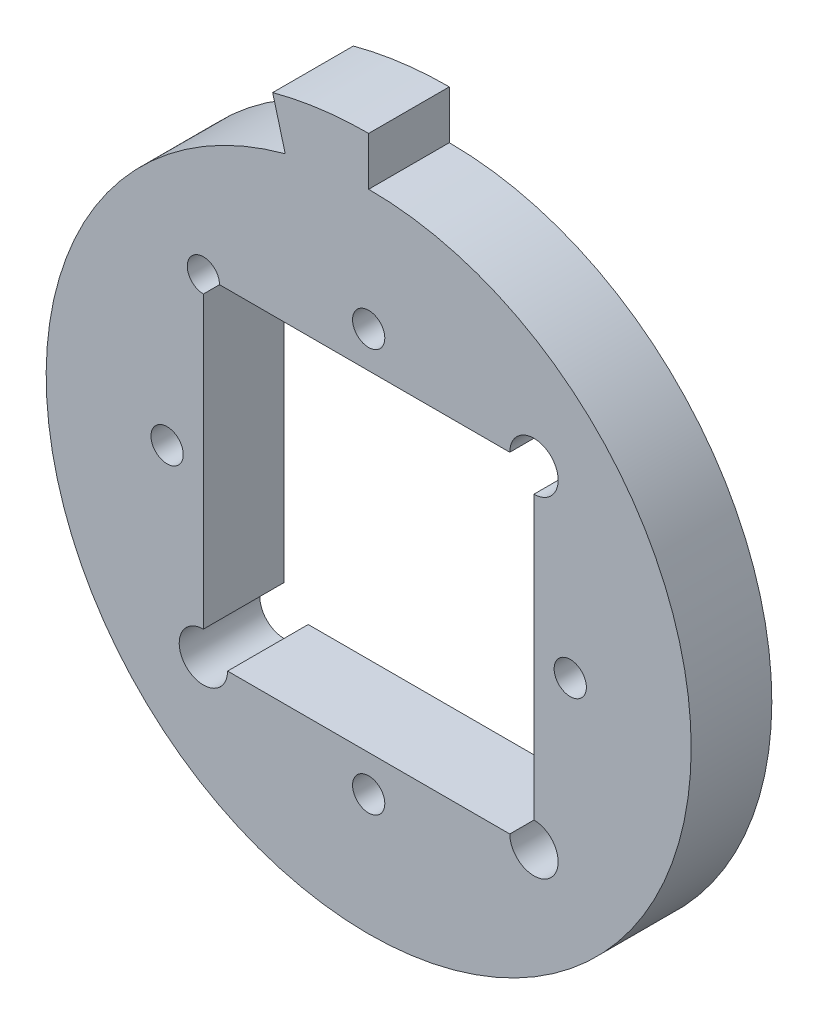
ISO-10303-21;
HEADER;
FILE_DESCRIPTION(('STEP AP214'),'2;1');
FILE_NAME('part.step','',(''),(''),'','','');
FILE_SCHEMA(('AUTOMOTIVE_DESIGN { 1 0 10303 214 1 1 1 1 }'));
ENDSEC;
DATA;
#1=APPLICATION_CONTEXT('core data for automotive mechanical design processes');
#2=APPLICATION_PROTOCOL_DEFINITION('international standard','automotive_design',2000,#1);
#3=PRODUCT_CONTEXT('',#1,'mechanical');
#4=PRODUCT('Part','Part','',(#3));
#5=PRODUCT_RELATED_PRODUCT_CATEGORY('part','',(#4));
#6=PRODUCT_DEFINITION_FORMATION('','',#4);
#7=PRODUCT_DEFINITION_CONTEXT('part definition',#1,'design');
#8=PRODUCT_DEFINITION('design','',#6,#7);
#9=PRODUCT_DEFINITION_SHAPE('','',#8);
#10=(LENGTH_UNIT() NAMED_UNIT(*) SI_UNIT(.MILLI.,.METRE.));
#11=(NAMED_UNIT(*) PLANE_ANGLE_UNIT() SI_UNIT($,.RADIAN.));
#12=(NAMED_UNIT(*) SI_UNIT($,.STERADIAN.) SOLID_ANGLE_UNIT());
#13=UNCERTAINTY_MEASURE_WITH_UNIT(LENGTH_MEASURE(1.E-05),#10,'distance_accuracy_value','');
#14=(GEOMETRIC_REPRESENTATION_CONTEXT(3) GLOBAL_UNCERTAINTY_ASSIGNED_CONTEXT((#13)) GLOBAL_UNIT_ASSIGNED_CONTEXT((#10,
#11,#12)) REPRESENTATION_CONTEXT('',''));
#15=CARTESIAN_POINT('',(0.,0.,0.));
#16=DIRECTION('',(0.,0.,1.));
#17=DIRECTION('',(1.,0.,0.));
#18=AXIS2_PLACEMENT_3D('',#15,#16,#17);
#19=CARTESIAN_POINT('',(0.,0.,5.));
#20=DIRECTION('',(0.,0.,-1.));
#21=DIRECTION('',(-1.,0.,0.));
#22=AXIS2_PLACEMENT_3D('',#19,#20,#21);
#23=CYLINDRICAL_SURFACE('',#22,20.);
#24=CARTESIAN_POINT('',(0.,0.,0.));
#25=DIRECTION('',(0.,0.,1.));
#26=DIRECTION('',(1.,0.,0.));
#27=AXIS2_PLACEMENT_3D('',#24,#25,#26);
#28=CIRCLE('',#27,20.);
#29=CARTESIAN_POINT('',(-5.17638090205043,19.3185165257814,0.));
#30=VERTEX_POINT('',#29);
#31=CARTESIAN_POINT('',(0.,20.,0.));
#32=VERTEX_POINT('',#31);
#33=EDGE_CURVE('E294',#30,#32,#28,.T.);
#34=ORIENTED_EDGE('',*,*,#33,.T.);
#35=DIRECTION('',(0.,0.,-1.));
#36=VECTOR('',#35,1.);
#37=CARTESIAN_POINT('',(0.,20.,5.));
#38=LINE('',#37,#36);
#39=CARTESIAN_POINT('',(0.,20.,5.));
#40=VERTEX_POINT('',#39);
#41=EDGE_CURVE('E12',#40,#32,#38,.T.);
#42=ORIENTED_EDGE('',*,*,#41,.F.);
#43=CARTESIAN_POINT('',(0.,0.,5.));
#44=DIRECTION('',(0.,0.,1.));
#45=DIRECTION('',(1.,0.,0.));
#46=AXIS2_PLACEMENT_3D('',#43,#44,#45);
#47=CIRCLE('',#46,20.);
#48=CARTESIAN_POINT('',(-5.17638090205043,19.3185165257814,5.));
#49=VERTEX_POINT('',#48);
#50=EDGE_CURVE('E163',#49,#40,#47,.T.);
#51=ORIENTED_EDGE('',*,*,#50,.F.);
#52=DIRECTION('',(0.,0.,-1.));
#53=VECTOR('',#52,1.);
#54=CARTESIAN_POINT('',(-5.17638090205043,19.3185165257814,5.));
#55=LINE('',#54,#53);
#56=EDGE_CURVE('E266',#49,#30,#55,.T.);
#57=ORIENTED_EDGE('',*,*,#56,.T.);
#58=EDGE_LOOP('',(#34,#42,#51,#57));
#59=FACE_BOUND('',#58,.T.);
#60=ADVANCED_FACE('F48',(#59),#23,.T.);
#61=CARTESIAN_POINT('',(0.,0.,5.));
#62=DIRECTION('',(1.,0.,0.));
#63=DIRECTION('',(0.,0.,-1.));
#64=AXIS2_PLACEMENT_3D('',#61,#62,#63);
#65=PLANE('',#64);
#66=DIRECTION('',(0.,-1.,0.));
#67=VECTOR('',#66,1.);
#68=CARTESIAN_POINT('',(0.,0.,0.));
#69=LINE('',#68,#67);
#70=CARTESIAN_POINT('',(0.,23.,0.));
#71=VERTEX_POINT('',#70);
#72=EDGE_CURVE('E153',#71,#32,#69,.T.);
#73=ORIENTED_EDGE('',*,*,#72,.F.);
#74=DIRECTION('',(0.,0.,-1.));
#75=VECTOR('',#74,1.);
#76=CARTESIAN_POINT('',(0.,23.,5.));
#77=LINE('',#76,#75);
#78=CARTESIAN_POINT('',(0.,23.,5.));
#79=VERTEX_POINT('',#78);
#80=EDGE_CURVE('E59',#79,#71,#77,.T.);
#81=ORIENTED_EDGE('',*,*,#80,.F.);
#82=DIRECTION('',(0.,-1.,0.));
#83=VECTOR('',#82,1.);
#84=CARTESIAN_POINT('',(0.,0.,5.));
#85=LINE('',#84,#83);
#86=EDGE_CURVE('E151',#79,#40,#85,.T.);
#87=ORIENTED_EDGE('',*,*,#86,.T.);
#88=ORIENTED_EDGE('',*,*,#41,.T.);
#89=EDGE_LOOP('',(#73,#81,#87,#88));
#90=FACE_BOUND('',#89,.T.);
#91=ADVANCED_FACE('F149',(#90),#65,.T.);
#92=CARTESIAN_POINT('',(0.,0.,5.));
#93=DIRECTION('',(0.,0.,-1.));
#94=DIRECTION('',(-1.,0.,0.));
#95=AXIS2_PLACEMENT_3D('',#92,#93,#94);
#96=CYLINDRICAL_SURFACE('',#95,23.);
#97=CARTESIAN_POINT('',(0.,0.,0.));
#98=DIRECTION('',(0.,0.,1.));
#99=DIRECTION('',(1.,0.,0.));
#100=AXIS2_PLACEMENT_3D('',#97,#98,#99);
#101=CIRCLE('',#100,23.);
#102=CARTESIAN_POINT('',(-5.952838037358,22.2162940046486,0.));
#103=VERTEX_POINT('',#102);
#104=EDGE_CURVE('E107',#71,#103,#101,.T.);
#105=ORIENTED_EDGE('',*,*,#104,.T.);
#106=DIRECTION('',(0.,0.,-1.));
#107=VECTOR('',#106,1.);
#108=CARTESIAN_POINT('',(-5.952838037358,22.2162940046486,5.));
#109=LINE('',#108,#107);
#110=CARTESIAN_POINT('',(-5.952838037358,22.2162940046486,5.));
#111=VERTEX_POINT('',#110);
#112=EDGE_CURVE('E155',#111,#103,#109,.T.);
#113=ORIENTED_EDGE('',*,*,#112,.F.);
#114=CARTESIAN_POINT('',(0.,0.,5.));
#115=DIRECTION('',(0.,0.,1.));
#116=DIRECTION('',(1.,0.,0.));
#117=AXIS2_PLACEMENT_3D('',#114,#115,#116);
#118=CIRCLE('',#117,23.);
#119=EDGE_CURVE('E157',#79,#111,#118,.T.);
#120=ORIENTED_EDGE('',*,*,#119,.F.);
#121=ORIENTED_EDGE('',*,*,#80,.T.);
#122=EDGE_LOOP('',(#105,#113,#120,#121));
#123=FACE_BOUND('',#122,.T.);
#124=ADVANCED_FACE('F158',(#123),#96,.T.);
#125=CARTESIAN_POINT('',(-10.25,-10.25,5.));
#126=DIRECTION('',(0.,0.,-1.));
#127=DIRECTION('',(-1.,0.,0.));
#128=AXIS2_PLACEMENT_3D('',#125,#126,#127);
#129=CYLINDRICAL_SURFACE('',#128,1.5);
#130=CARTESIAN_POINT('',(-10.25,-10.25,0.));
#131=DIRECTION('',(0.,0.,1.));
#132=DIRECTION('',(1.,0.,0.));
#133=AXIS2_PLACEMENT_3D('',#130,#131,#132);
#134=CIRCLE('',#133,1.5);
#135=CARTESIAN_POINT('',(-10.25,-8.75,0.));
#136=VERTEX_POINT('',#135);
#137=CARTESIAN_POINT('',(-8.75,-10.25,0.));
#138=VERTEX_POINT('',#137);
#139=EDGE_CURVE('E323',#136,#138,#134,.T.);
#140=ORIENTED_EDGE('',*,*,#139,.F.);
#141=DIRECTION('',(0.,0.,-1.));
#142=VECTOR('',#141,1.);
#143=CARTESIAN_POINT('',(-10.25,-8.75,5.));
#144=LINE('',#143,#142);
#145=CARTESIAN_POINT('',(-10.25,-8.75,5.));
#146=VERTEX_POINT('',#145);
#147=EDGE_CURVE('E52',#146,#136,#144,.T.);
#148=ORIENTED_EDGE('',*,*,#147,.F.);
#149=CARTESIAN_POINT('',(-10.25,-10.25,5.));
#150=DIRECTION('',(0.,0.,1.));
#151=DIRECTION('',(1.,0.,0.));
#152=AXIS2_PLACEMENT_3D('',#149,#150,#151);
#153=CIRCLE('',#152,1.5);
#154=CARTESIAN_POINT('',(-8.75,-10.25,5.));
#155=VERTEX_POINT('',#154);
#156=EDGE_CURVE('E213',#146,#155,#153,.T.);
#157=ORIENTED_EDGE('',*,*,#156,.T.);
#158=DIRECTION('',(0.,0.,-1.));
#159=VECTOR('',#158,1.);
#160=CARTESIAN_POINT('',(-8.75,-10.25,5.));
#161=LINE('',#160,#159);
#162=EDGE_CURVE('E281',#155,#138,#161,.T.);
#163=ORIENTED_EDGE('',*,*,#162,.T.);
#164=EDGE_LOOP('',(#140,#148,#157,#163));
#165=FACE_BOUND('',#164,.T.);
#166=ADVANCED_FACE('F50',(#165),#129,.F.);
#167=CARTESIAN_POINT('',(-10.25,0.,5.));
#168=DIRECTION('',(1.,0.,0.));
#169=DIRECTION('',(0.,1.,0.));
#170=AXIS2_PLACEMENT_3D('',#167,#168,#169);
#171=PLANE('',#170);
#172=DIRECTION('',(0.,-1.,0.));
#173=VECTOR('',#172,1.);
#174=CARTESIAN_POINT('',(-10.25,0.,0.));
#175=LINE('',#174,#173);
#176=CARTESIAN_POINT('',(-10.25,9.25,0.));
#177=VERTEX_POINT('',#176);
#178=EDGE_CURVE('E258',#177,#136,#175,.T.);
#179=ORIENTED_EDGE('',*,*,#178,.F.);
#180=DIRECTION('',(0.,0.,-1.));
#181=VECTOR('',#180,1.);
#182=CARTESIAN_POINT('',(-10.25,9.25,5.));
#183=LINE('',#182,#181);
#184=CARTESIAN_POINT('',(-10.25,9.25,5.));
#185=VERTEX_POINT('',#184);
#186=EDGE_CURVE('E256',#185,#177,#183,.T.);
#187=ORIENTED_EDGE('',*,*,#186,.F.);
#188=DIRECTION('',(0.,-1.,0.));
#189=VECTOR('',#188,1.);
#190=CARTESIAN_POINT('',(-10.25,0.,5.));
#191=LINE('',#190,#189);
#192=EDGE_CURVE('E208',#185,#146,#191,.T.);
#193=ORIENTED_EDGE('',*,*,#192,.T.);
#194=ORIENTED_EDGE('',*,*,#147,.T.);
#195=EDGE_LOOP('',(#179,#187,#193,#194));
#196=FACE_BOUND('',#195,.T.);
#197=ADVANCED_FACE('F255',(#196),#171,.T.);
#198=CARTESIAN_POINT('',(-10.25,10.25,5.));
#199=DIRECTION('',(0.,0.,-1.));
#200=DIRECTION('',(-1.,0.,0.));
#201=AXIS2_PLACEMENT_3D('',#198,#199,#200);
#202=CYLINDRICAL_SURFACE('',#201,1.);
#203=CARTESIAN_POINT('',(-10.25,10.25,0.));
#204=DIRECTION('',(0.,0.,1.));
#205=DIRECTION('',(1.,0.,0.));
#206=AXIS2_PLACEMENT_3D('',#203,#204,#205);
#207=CIRCLE('',#206,1.);
#208=CARTESIAN_POINT('',(-9.25000000000001,10.25,0.));
#209=VERTEX_POINT('',#208);
#210=EDGE_CURVE('E318',#209,#177,#207,.T.);
#211=ORIENTED_EDGE('',*,*,#210,.F.);
#212=DIRECTION('',(0.,0.,-1.));
#213=VECTOR('',#212,1.);
#214=CARTESIAN_POINT('',(-9.25000000000001,10.25,5.));
#215=LINE('',#214,#213);
#216=CARTESIAN_POINT('',(-9.25000000000001,10.25,5.));
#217=VERTEX_POINT('',#216);
#218=EDGE_CURVE('E263',#217,#209,#215,.T.);
#219=ORIENTED_EDGE('',*,*,#218,.F.);
#220=CARTESIAN_POINT('',(-10.25,10.25,5.));
#221=DIRECTION('',(0.,0.,1.));
#222=DIRECTION('',(1.,0.,0.));
#223=AXIS2_PLACEMENT_3D('',#220,#221,#222);
#224=CIRCLE('',#223,1.);
#225=EDGE_CURVE('E203',#217,#185,#224,.T.);
#226=ORIENTED_EDGE('',*,*,#225,.T.);
#227=ORIENTED_EDGE('',*,*,#186,.T.);
#228=EDGE_LOOP('',(#211,#219,#226,#227));
#229=FACE_BOUND('',#228,.T.);
#230=ADVANCED_FACE('F398',(#229),#202,.F.);
#231=CARTESIAN_POINT('',(0.,10.25,5.));
#232=DIRECTION('',(0.,1.,0.));
#233=DIRECTION('',(-1.,0.,0.));
#234=AXIS2_PLACEMENT_3D('',#231,#232,#233);
#235=PLANE('',#234);
#236=DIRECTION('',(1.,0.,0.));
#237=VECTOR('',#236,1.);
#238=CARTESIAN_POINT('',(0.,10.25,0.));
#239=LINE('',#238,#237);
#240=CARTESIAN_POINT('',(8.74999999999999,10.25,0.));
#241=VERTEX_POINT('',#240);
#242=EDGE_CURVE('E314',#209,#241,#239,.T.);
#243=ORIENTED_EDGE('',*,*,#242,.T.);
#244=DIRECTION('',(0.,0.,-1.));
#245=VECTOR('',#244,1.);
#246=CARTESIAN_POINT('',(8.74999999999999,10.25,5.));
#247=LINE('',#246,#245);
#248=CARTESIAN_POINT('',(8.74999999999999,10.25,5.));
#249=VERTEX_POINT('',#248);
#250=EDGE_CURVE('E267',#249,#241,#247,.T.);
#251=ORIENTED_EDGE('',*,*,#250,.F.);
#252=DIRECTION('',(1.,0.,0.));
#253=VECTOR('',#252,1.);
#254=CARTESIAN_POINT('',(0.,10.25,5.));
#255=LINE('',#254,#253);
#256=EDGE_CURVE('E200',#217,#249,#255,.T.);
#257=ORIENTED_EDGE('',*,*,#256,.F.);
#258=ORIENTED_EDGE('',*,*,#218,.T.);
#259=EDGE_LOOP('',(#243,#251,#257,#258));
#260=FACE_BOUND('',#259,.T.);
#261=ADVANCED_FACE('F394',(#260),#235,.F.);
#262=CARTESIAN_POINT('',(10.25,10.25,5.));
#263=DIRECTION('',(0.,0.,-1.));
#264=DIRECTION('',(-1.,0.,0.));
#265=AXIS2_PLACEMENT_3D('',#262,#263,#264);
#266=CYLINDRICAL_SURFACE('',#265,1.5);
#267=CARTESIAN_POINT('',(10.25,10.25,0.));
#268=DIRECTION('',(0.,0.,1.));
#269=DIRECTION('',(1.,0.,0.));
#270=AXIS2_PLACEMENT_3D('',#267,#268,#269);
#271=CIRCLE('',#270,1.5);
#272=CARTESIAN_POINT('',(10.25,8.75,0.));
#273=VERTEX_POINT('',#272);
#274=EDGE_CURVE('E310',#273,#241,#271,.T.);
#275=ORIENTED_EDGE('',*,*,#274,.F.);
#276=DIRECTION('',(0.,0.,-1.));
#277=VECTOR('',#276,1.);
#278=CARTESIAN_POINT('',(10.25,8.75,5.));
#279=LINE('',#278,#277);
#280=CARTESIAN_POINT('',(10.25,8.75,5.));
#281=VERTEX_POINT('',#280);
#282=EDGE_CURVE('E272',#281,#273,#279,.T.);
#283=ORIENTED_EDGE('',*,*,#282,.F.);
#284=CARTESIAN_POINT('',(10.25,10.25,5.));
#285=DIRECTION('',(0.,0.,1.));
#286=DIRECTION('',(1.,0.,0.));
#287=AXIS2_PLACEMENT_3D('',#284,#285,#286);
#288=CIRCLE('',#287,1.5);
#289=EDGE_CURVE('E192',#281,#249,#288,.T.);
#290=ORIENTED_EDGE('',*,*,#289,.T.);
#291=ORIENTED_EDGE('',*,*,#250,.T.);
#292=EDGE_LOOP('',(#275,#283,#290,#291));
#293=FACE_BOUND('',#292,.T.);
#294=ADVANCED_FACE('F390',(#293),#266,.F.);
#295=CARTESIAN_POINT('',(10.25,0.,5.));
#296=DIRECTION('',(1.,0.,0.));
#297=DIRECTION('',(0.,1.,0.));
#298=AXIS2_PLACEMENT_3D('',#295,#296,#297);
#299=PLANE('',#298);
#300=DIRECTION('',(0.,-1.,0.));
#301=VECTOR('',#300,1.);
#302=CARTESIAN_POINT('',(10.25,0.,0.));
#303=LINE('',#302,#301);
#304=CARTESIAN_POINT('',(10.25,-8.75,0.));
#305=VERTEX_POINT('',#304);
#306=EDGE_CURVE('E306',#273,#305,#303,.T.);
#307=ORIENTED_EDGE('',*,*,#306,.T.);
#308=DIRECTION('',(0.,0.,-1.));
#309=VECTOR('',#308,1.);
#310=CARTESIAN_POINT('',(10.25,-8.75,5.));
#311=LINE('',#310,#309);
#312=CARTESIAN_POINT('',(10.25,-8.75,5.));
#313=VERTEX_POINT('',#312);
#314=EDGE_CURVE('E275',#313,#305,#311,.T.);
#315=ORIENTED_EDGE('',*,*,#314,.F.);
#316=DIRECTION('',(0.,-1.,0.));
#317=VECTOR('',#316,1.);
#318=CARTESIAN_POINT('',(10.25,0.,5.));
#319=LINE('',#318,#317);
#320=EDGE_CURVE('E188',#281,#313,#319,.T.);
#321=ORIENTED_EDGE('',*,*,#320,.F.);
#322=ORIENTED_EDGE('',*,*,#282,.T.);
#323=EDGE_LOOP('',(#307,#315,#321,#322));
#324=FACE_BOUND('',#323,.T.);
#325=ADVANCED_FACE('F386',(#324),#299,.F.);
#326=CARTESIAN_POINT('',(10.25,-10.25,5.));
#327=DIRECTION('',(0.,0.,-1.));
#328=DIRECTION('',(-1.,0.,0.));
#329=AXIS2_PLACEMENT_3D('',#326,#327,#328);
#330=CYLINDRICAL_SURFACE('',#329,1.5);
#331=CARTESIAN_POINT('',(10.25,-10.25,0.));
#332=DIRECTION('',(0.,0.,1.));
#333=DIRECTION('',(1.,0.,0.));
#334=AXIS2_PLACEMENT_3D('',#331,#332,#333);
#335=CIRCLE('',#334,1.5);
#336=CARTESIAN_POINT('',(8.75,-10.25,0.));
#337=VERTEX_POINT('',#336);
#338=EDGE_CURVE('E302',#337,#305,#335,.T.);
#339=ORIENTED_EDGE('',*,*,#338,.F.);
#340=DIRECTION('',(0.,0.,-1.));
#341=VECTOR('',#340,1.);
#342=CARTESIAN_POINT('',(8.75,-10.25,5.));
#343=LINE('',#342,#341);
#344=CARTESIAN_POINT('',(8.75,-10.25,5.));
#345=VERTEX_POINT('',#344);
#346=EDGE_CURVE('E278',#345,#337,#343,.T.);
#347=ORIENTED_EDGE('',*,*,#346,.F.);
#348=CARTESIAN_POINT('',(10.25,-10.25,5.));
#349=DIRECTION('',(0.,0.,1.));
#350=DIRECTION('',(1.,0.,0.));
#351=AXIS2_PLACEMENT_3D('',#348,#349,#350);
#352=CIRCLE('',#351,1.5);
#353=EDGE_CURVE('E183',#345,#313,#352,.T.);
#354=ORIENTED_EDGE('',*,*,#353,.T.);
#355=ORIENTED_EDGE('',*,*,#314,.T.);
#356=EDGE_LOOP('',(#339,#347,#354,#355));
#357=FACE_BOUND('',#356,.T.);
#358=ADVANCED_FACE('F382',(#357),#330,.F.);
#359=CARTESIAN_POINT('',(0.,-10.25,5.));
#360=DIRECTION('',(0.,1.,0.));
#361=DIRECTION('',(0.,0.,1.));
#362=AXIS2_PLACEMENT_3D('',#359,#360,#361);
#363=PLANE('',#362);
#364=DIRECTION('',(1.,0.,0.));
#365=VECTOR('',#364,1.);
#366=CARTESIAN_POINT('',(0.,-10.25,0.));
#367=LINE('',#366,#365);
#368=EDGE_CURVE('E298',#138,#337,#367,.T.);
#369=ORIENTED_EDGE('',*,*,#368,.F.);
#370=ORIENTED_EDGE('',*,*,#162,.F.);
#371=DIRECTION('',(1.,0.,0.));
#372=VECTOR('',#371,1.);
#373=CARTESIAN_POINT('',(0.,-10.25,5.));
#374=LINE('',#373,#372);
#375=EDGE_CURVE('E168',#155,#345,#374,.T.);
#376=ORIENTED_EDGE('',*,*,#375,.T.);
#377=ORIENTED_EDGE('',*,*,#346,.T.);
#378=EDGE_LOOP('',(#369,#370,#376,#377));
#379=FACE_BOUND('',#378,.T.);
#380=ADVANCED_FACE('F379',(#379),#363,.T.);
#381=CARTESIAN_POINT('',(0.,0.,5.));
#382=DIRECTION('',(0.965925826289068,0.258819045102521,0.));
#383=DIRECTION('',(-0.258819045102521,0.965925826289068,0.));
#384=AXIS2_PLACEMENT_3D('',#381,#382,#383);
#385=PLANE('',#384);
#386=DIRECTION('',(0.258819045102521,-0.965925826289068,0.));
#387=VECTOR('',#386,1.);
#388=CARTESIAN_POINT('',(0.,0.,0.));
#389=LINE('',#388,#387);
#390=EDGE_CURVE('E113',#103,#30,#389,.T.);
#391=ORIENTED_EDGE('',*,*,#390,.T.);
#392=ORIENTED_EDGE('',*,*,#56,.F.);
#393=DIRECTION('',(0.258819045102521,-0.965925826289068,0.));
#394=VECTOR('',#393,1.);
#395=CARTESIAN_POINT('',(0.,0.,5.));
#396=LINE('',#395,#394);
#397=EDGE_CURVE('E68',#111,#49,#396,.T.);
#398=ORIENTED_EDGE('',*,*,#397,.F.);
#399=ORIENTED_EDGE('',*,*,#112,.T.);
#400=EDGE_LOOP('',(#391,#392,#398,#399));
#401=FACE_BOUND('',#400,.T.);
#402=ADVANCED_FACE('F245',(#401),#385,.F.);
#403=CARTESIAN_POINT('',(0.,0.,5.));
#404=DIRECTION('',(0.,0.,1.));
#405=DIRECTION('',(1.,0.,0.));
#406=AXIS2_PLACEMENT_3D('',#403,#404,#405);
#407=PLANE('',#406);
#408=CARTESIAN_POINT('',(0.,12.5,5.));
#409=DIRECTION('',(0.,0.,1.));
#410=DIRECTION('',(1.,0.,0.));
#411=AXIS2_PLACEMENT_3D('',#408,#409,#410);
#412=CIRCLE('',#411,1.);
#413=CARTESIAN_POINT('',(1.,12.5,5.));
#414=VERTEX_POINT('',#413);
#415=EDGE_CURVE('E332',#414,#414,#412,.T.);
#416=ORIENTED_EDGE('',*,*,#415,.F.);
#417=EDGE_LOOP('',(#416));
#418=FACE_BOUND('',#417,.T.);
#419=CARTESIAN_POINT('',(12.5,0.,5.));
#420=DIRECTION('',(0.,0.,1.));
#421=DIRECTION('',(1.,0.,0.));
#422=AXIS2_PLACEMENT_3D('',#419,#420,#421);
#423=CIRCLE('',#422,1.);
#424=CARTESIAN_POINT('',(13.5,0.,5.));
#425=VERTEX_POINT('',#424);
#426=EDGE_CURVE('E338',#425,#425,#423,.T.);
#427=ORIENTED_EDGE('',*,*,#426,.F.);
#428=EDGE_LOOP('',(#427));
#429=FACE_BOUND('',#428,.T.);
#430=CARTESIAN_POINT('',(0.,-12.5,5.));
#431=DIRECTION('',(0.,0.,1.));
#432=DIRECTION('',(1.,0.,0.));
#433=AXIS2_PLACEMENT_3D('',#430,#431,#432);
#434=CIRCLE('',#433,1.);
#435=CARTESIAN_POINT('',(1.,-12.5,5.));
#436=VERTEX_POINT('',#435);
#437=EDGE_CURVE('E350',#436,#436,#434,.T.);
#438=ORIENTED_EDGE('',*,*,#437,.F.);
#439=EDGE_LOOP('',(#438));
#440=FACE_BOUND('',#439,.T.);
#441=CARTESIAN_POINT('',(-12.5,0.,5.));
#442=DIRECTION('',(0.,0.,1.));
#443=DIRECTION('',(1.,0.,0.));
#444=AXIS2_PLACEMENT_3D('',#441,#442,#443);
#445=CIRCLE('',#444,1.);
#446=CARTESIAN_POINT('',(-11.5,0.,5.));
#447=VERTEX_POINT('',#446);
#448=EDGE_CURVE('E222',#447,#447,#445,.T.);
#449=ORIENTED_EDGE('',*,*,#448,.F.);
#450=EDGE_LOOP('',(#449));
#451=FACE_BOUND('',#450,.T.);
#452=ORIENTED_EDGE('',*,*,#156,.F.);
#453=ORIENTED_EDGE('',*,*,#192,.F.);
#454=ORIENTED_EDGE('',*,*,#225,.F.);
#455=ORIENTED_EDGE('',*,*,#256,.T.);
#456=ORIENTED_EDGE('',*,*,#289,.F.);
#457=ORIENTED_EDGE('',*,*,#320,.T.);
#458=ORIENTED_EDGE('',*,*,#353,.F.);
#459=ORIENTED_EDGE('',*,*,#375,.F.);
#460=EDGE_LOOP('',(#452,#453,#454,#455,#456,#457,#458,#459));
#461=FACE_BOUND('',#460,.T.);
#462=ORIENTED_EDGE('',*,*,#50,.T.);
#463=ORIENTED_EDGE('',*,*,#86,.F.);
#464=ORIENTED_EDGE('',*,*,#119,.T.);
#465=ORIENTED_EDGE('',*,*,#397,.T.);
#466=EDGE_LOOP('',(#462,#463,#464,#465));
#467=FACE_BOUND('',#466,.T.);
#468=ADVANCED_FACE('F161',(#418,#429,#440,#451,#461,#467),#407,.T.);
#469=CARTESIAN_POINT('',(0.,0.,0.));
#470=DIRECTION('',(0.,0.,1.));
#471=DIRECTION('',(1.,0.,0.));
#472=AXIS2_PLACEMENT_3D('',#469,#470,#471);
#473=PLANE('',#472);
#474=CARTESIAN_POINT('',(0.,12.5,0.));
#475=DIRECTION('',(0.,0.,1.));
#476=DIRECTION('',(1.,0.,0.));
#477=AXIS2_PLACEMENT_3D('',#474,#475,#476);
#478=CIRCLE('',#477,1.);
#479=CARTESIAN_POINT('',(1.,12.5,0.));
#480=VERTEX_POINT('',#479);
#481=EDGE_CURVE('E326',#480,#480,#478,.T.);
#482=ORIENTED_EDGE('',*,*,#481,.T.);
#483=EDGE_LOOP('',(#482));
#484=FACE_BOUND('',#483,.T.);
#485=CARTESIAN_POINT('',(12.5,0.,0.));
#486=DIRECTION('',(0.,0.,1.));
#487=DIRECTION('',(1.,0.,0.));
#488=AXIS2_PLACEMENT_3D('',#485,#486,#487);
#489=CIRCLE('',#488,1.);
#490=CARTESIAN_POINT('',(13.5,0.,0.));
#491=VERTEX_POINT('',#490);
#492=EDGE_CURVE('E347',#491,#491,#489,.T.);
#493=ORIENTED_EDGE('',*,*,#492,.T.);
#494=EDGE_LOOP('',(#493));
#495=FACE_BOUND('',#494,.T.);
#496=CARTESIAN_POINT('',(0.,-12.5,0.));
#497=DIRECTION('',(0.,0.,1.));
#498=DIRECTION('',(1.,0.,0.));
#499=AXIS2_PLACEMENT_3D('',#496,#497,#498);
#500=CIRCLE('',#499,1.);
#501=CARTESIAN_POINT('',(1.,-12.5,0.));
#502=VERTEX_POINT('',#501);
#503=EDGE_CURVE('E227',#502,#502,#500,.T.);
#504=ORIENTED_EDGE('',*,*,#503,.T.);
#505=EDGE_LOOP('',(#504));
#506=FACE_BOUND('',#505,.T.);
#507=CARTESIAN_POINT('',(-12.5,0.,0.));
#508=DIRECTION('',(0.,0.,1.));
#509=DIRECTION('',(1.,0.,0.));
#510=AXIS2_PLACEMENT_3D('',#507,#508,#509);
#511=CIRCLE('',#510,1.);
#512=CARTESIAN_POINT('',(-11.5,0.,0.));
#513=VERTEX_POINT('',#512);
#514=EDGE_CURVE('E228',#513,#513,#511,.T.);
#515=ORIENTED_EDGE('',*,*,#514,.T.);
#516=EDGE_LOOP('',(#515));
#517=FACE_BOUND('',#516,.T.);
#518=ORIENTED_EDGE('',*,*,#139,.T.);
#519=ORIENTED_EDGE('',*,*,#368,.T.);
#520=ORIENTED_EDGE('',*,*,#338,.T.);
#521=ORIENTED_EDGE('',*,*,#306,.F.);
#522=ORIENTED_EDGE('',*,*,#274,.T.);
#523=ORIENTED_EDGE('',*,*,#242,.F.);
#524=ORIENTED_EDGE('',*,*,#210,.T.);
#525=ORIENTED_EDGE('',*,*,#178,.T.);
#526=EDGE_LOOP('',(#518,#519,#520,#521,#522,#523,#524,#525));
#527=FACE_BOUND('',#526,.T.);
#528=ORIENTED_EDGE('',*,*,#33,.F.);
#529=ORIENTED_EDGE('',*,*,#390,.F.);
#530=ORIENTED_EDGE('',*,*,#104,.F.);
#531=ORIENTED_EDGE('',*,*,#72,.T.);
#532=EDGE_LOOP('',(#528,#529,#530,#531));
#533=FACE_BOUND('',#532,.T.);
#534=ADVANCED_FACE('F233',(#484,#495,#506,#517,#527,#533),#473,.F.);
#535=CARTESIAN_POINT('',(-12.5,0.,0.));
#536=DIRECTION('',(0.,0.,1.));
#537=DIRECTION('',(1.,0.,0.));
#538=AXIS2_PLACEMENT_3D('',#535,#536,#537);
#539=CYLINDRICAL_SURFACE('',#538,1.);
#540=ORIENTED_EDGE('',*,*,#514,.F.);
#541=EDGE_LOOP('',(#540));
#542=FACE_BOUND('',#541,.T.);
#543=ORIENTED_EDGE('',*,*,#448,.T.);
#544=EDGE_LOOP('',(#543));
#545=FACE_BOUND('',#544,.T.);
#546=ADVANCED_FACE('F236',(#542,#545),#539,.F.);
#547=CARTESIAN_POINT('',(0.,-12.5,0.));
#548=DIRECTION('',(0.,0.,1.));
#549=DIRECTION('',(1.,0.,0.));
#550=AXIS2_PLACEMENT_3D('',#547,#548,#549);
#551=CYLINDRICAL_SURFACE('',#550,1.);
#552=ORIENTED_EDGE('',*,*,#503,.F.);
#553=EDGE_LOOP('',(#552));
#554=FACE_BOUND('',#553,.T.);
#555=ORIENTED_EDGE('',*,*,#437,.T.);
#556=EDGE_LOOP('',(#555));
#557=FACE_BOUND('',#556,.T.);
#558=ADVANCED_FACE('F239',(#554,#557),#551,.F.);
#559=CARTESIAN_POINT('',(12.5,0.,0.));
#560=DIRECTION('',(0.,0.,1.));
#561=DIRECTION('',(1.,0.,0.));
#562=AXIS2_PLACEMENT_3D('',#559,#560,#561);
#563=CYLINDRICAL_SURFACE('',#562,1.);
#564=ORIENTED_EDGE('',*,*,#492,.F.);
#565=EDGE_LOOP('',(#564));
#566=FACE_BOUND('',#565,.T.);
#567=ORIENTED_EDGE('',*,*,#426,.T.);
#568=EDGE_LOOP('',(#567));
#569=FACE_BOUND('',#568,.T.);
#570=ADVANCED_FACE('F362',(#566,#569),#563,.F.);
#571=CARTESIAN_POINT('',(0.,12.5,0.));
#572=DIRECTION('',(0.,0.,1.));
#573=DIRECTION('',(1.,0.,0.));
#574=AXIS2_PLACEMENT_3D('',#571,#572,#573);
#575=CYLINDRICAL_SURFACE('',#574,1.);
#576=ORIENTED_EDGE('',*,*,#481,.F.);
#577=EDGE_LOOP('',(#576));
#578=FACE_BOUND('',#577,.T.);
#579=ORIENTED_EDGE('',*,*,#415,.T.);
#580=EDGE_LOOP('',(#579));
#581=FACE_BOUND('',#580,.T.);
#582=ADVANCED_FACE('F367',(#578,#581),#575,.F.);
#583=CLOSED_SHELL('',(#60,#91,#124,#166,#197,#230,#261,#294,#325,#358,#380,#402,#468,#534,#546,
#558,#570,#582));
#584=MANIFOLD_SOLID_BREP('B2',#583);
#585=ADVANCED_BREP_SHAPE_REPRESENTATION('',(#18,#584),#14);
#586=SHAPE_DEFINITION_REPRESENTATION(#9,#585);
ENDSEC;
END-ISO-10303-21;
